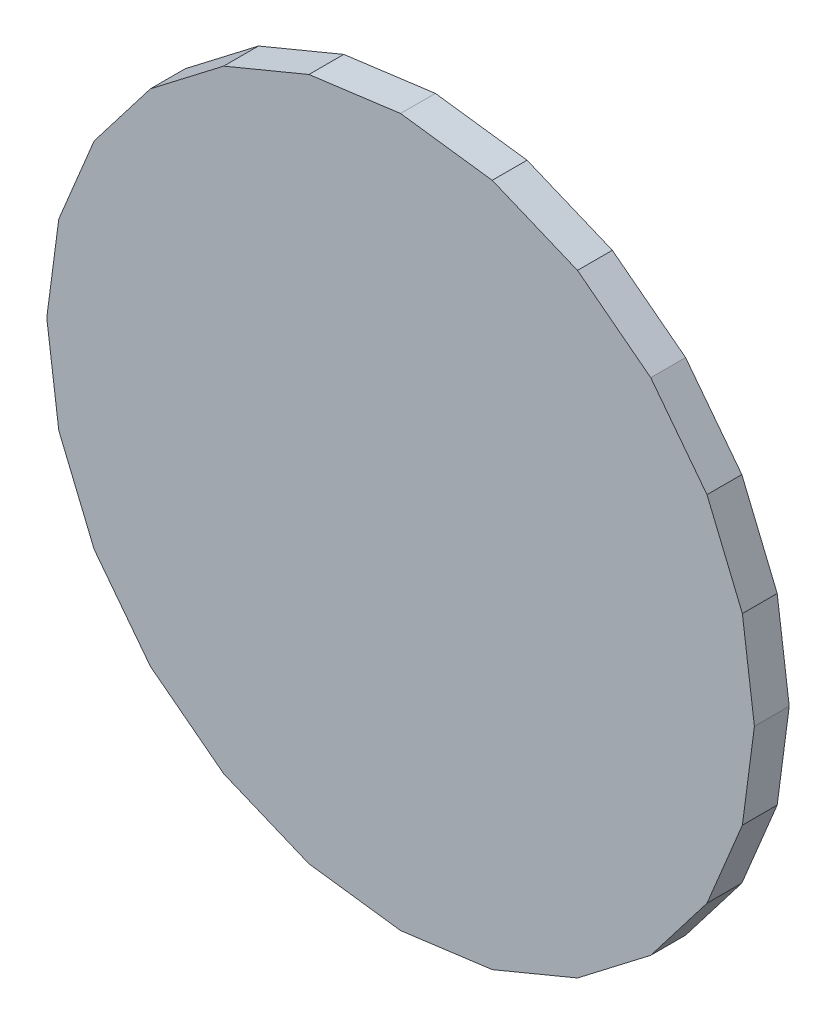
ISO-10303-21;
HEADER;
FILE_DESCRIPTION(('STEP AP214'),'2;1');
FILE_NAME('part.step','',(''),(''),'','','');
FILE_SCHEMA(('AUTOMOTIVE_DESIGN { 1 0 10303 214 1 1 1 1 }'));
ENDSEC;
DATA;
#1=APPLICATION_CONTEXT('core data for automotive mechanical design processes');
#2=APPLICATION_PROTOCOL_DEFINITION('international standard','automotive_design',2000,#1);
#3=PRODUCT_CONTEXT('',#1,'mechanical');
#4=PRODUCT('Part','Part','',(#3));
#5=PRODUCT_RELATED_PRODUCT_CATEGORY('part','',(#4));
#6=PRODUCT_DEFINITION_FORMATION('','',#4);
#7=PRODUCT_DEFINITION_CONTEXT('part definition',#1,'design');
#8=PRODUCT_DEFINITION('design','',#6,#7);
#9=PRODUCT_DEFINITION_SHAPE('','',#8);
#10=(LENGTH_UNIT() NAMED_UNIT(*) SI_UNIT(.MILLI.,.METRE.));
#11=(NAMED_UNIT(*) PLANE_ANGLE_UNIT() SI_UNIT($,.RADIAN.));
#12=(NAMED_UNIT(*) SI_UNIT($,.STERADIAN.) SOLID_ANGLE_UNIT());
#13=UNCERTAINTY_MEASURE_WITH_UNIT(LENGTH_MEASURE(1.E-05),#10,'distance_accuracy_value','');
#14=(GEOMETRIC_REPRESENTATION_CONTEXT(3) GLOBAL_UNCERTAINTY_ASSIGNED_CONTEXT((#13)) GLOBAL_UNIT_ASSIGNED_CONTEXT((#10,
#11,#12)) REPRESENTATION_CONTEXT('',''));
#15=CARTESIAN_POINT('',(0.,0.,0.));
#16=DIRECTION('',(0.,0.,1.));
#17=DIRECTION('',(1.,0.,0.));
#18=AXIS2_PLACEMENT_3D('',#15,#16,#17);
#19=CARTESIAN_POINT('',(0.,0.,0.05));
#20=DIRECTION('',(0.,0.,1.));
#21=DIRECTION('',(1.,0.,0.));
#22=AXIS2_PLACEMENT_3D('',#19,#20,#21);
#23=PLANE('',#22);
#24=DIRECTION('',(-0.923642864459661,0.383254300605684,0.));
#25=VECTOR('',#24,1.);
#26=CARTESIAN_POINT('',(0.254,0.439928,0.05));
#27=LINE('',#26,#25);
#28=CARTESIAN_POINT('',(0.131572,0.490728,0.05));
#29=VERTEX_POINT('',#28);
#30=CARTESIAN_POINT('',(0.254000000000001,0.439928000000001,0.05));
#31=VERTEX_POINT('',#30);
#32=EDGE_CURVE('E190',#29,#31,#27,.F.);
#33=ORIENTED_EDGE('',*,*,#32,.F.);
#34=DIRECTION('',(-0.991493340478673,0.130157426935396,0.));
#35=VECTOR('',#34,1.);
#36=CARTESIAN_POINT('',(0.131572,0.490728,0.05));
#37=LINE('',#36,#35);
#38=CARTESIAN_POINT('',(0.,0.507999999999999,0.05));
#39=VERTEX_POINT('',#38);
#40=EDGE_CURVE('E20',#39,#29,#37,.F.);
#41=ORIENTED_EDGE('',*,*,#40,.F.);
#42=DIRECTION('',(-0.991493340478673,-0.130157426935396,0.));
#43=VECTOR('',#42,1.);
#44=CARTESIAN_POINT('',(0.,0.508,0.05));
#45=LINE('',#44,#43);
#46=CARTESIAN_POINT('',(-0.131572,0.490728000000001,0.05));
#47=VERTEX_POINT('',#46);
#48=EDGE_CURVE('E179',#47,#39,#45,.F.);
#49=ORIENTED_EDGE('',*,*,#48,.F.);
#50=DIRECTION('',(-0.923642864459661,-0.383254300605684,0.));
#51=VECTOR('',#50,1.);
#52=CARTESIAN_POINT('',(-0.131572,0.490728,0.05));
#53=LINE('',#52,#51);
#54=CARTESIAN_POINT('',(-0.254,0.439927999999999,0.05));
#55=VERTEX_POINT('',#54);
#56=EDGE_CURVE('E174',#55,#47,#53,.F.);
#57=ORIENTED_EDGE('',*,*,#56,.F.);
#58=DIRECTION('',(-0.793051061905808,-0.609155163492906,0.));
#59=VECTOR('',#58,1.);
#60=CARTESIAN_POINT('',(-0.254,0.439928,0.05));
#61=LINE('',#60,#59);
#62=CARTESIAN_POINT('',(-0.359155999999999,0.359155999999999,0.05));
#63=VERTEX_POINT('',#62);
#64=EDGE_CURVE('E201',#63,#55,#61,.F.);
#65=ORIENTED_EDGE('',*,*,#64,.F.);
#66=DIRECTION('',(-0.609155163492906,-0.793051061905808,0.));
#67=VECTOR('',#66,1.);
#68=CARTESIAN_POINT('',(-0.359156,0.359156,0.05));
#69=LINE('',#68,#67);
#70=CARTESIAN_POINT('',(-0.439928000000001,0.254000000000001,0.05));
#71=VERTEX_POINT('',#70);
#72=EDGE_CURVE('E205',#71,#63,#69,.F.);
#73=ORIENTED_EDGE('',*,*,#72,.F.);
#74=DIRECTION('',(-0.383254300605684,-0.923642864459661,0.));
#75=VECTOR('',#74,1.);
#76=CARTESIAN_POINT('',(-0.439928,0.254,0.05));
#77=LINE('',#76,#75);
#78=CARTESIAN_POINT('',(-0.490728,0.131572,0.05));
#79=VERTEX_POINT('',#78);
#80=EDGE_CURVE('E209',#79,#71,#77,.F.);
#81=ORIENTED_EDGE('',*,*,#80,.F.);
#82=DIRECTION('',(-0.130157426935396,-0.991493340478673,0.));
#83=VECTOR('',#82,1.);
#84=CARTESIAN_POINT('',(-0.490728,0.131572,0.05));
#85=LINE('',#84,#83);
#86=CARTESIAN_POINT('',(-0.507999999999999,0.,0.05));
#87=VERTEX_POINT('',#86);
#88=EDGE_CURVE('E213',#87,#79,#85,.F.);
#89=ORIENTED_EDGE('',*,*,#88,.F.);
#90=DIRECTION('',(0.130157426935396,-0.991493340478673,0.));
#91=VECTOR('',#90,1.);
#92=CARTESIAN_POINT('',(-0.508,0.,0.05));
#93=LINE('',#92,#91);
#94=CARTESIAN_POINT('',(-0.490728000000001,-0.131572,0.05));
#95=VERTEX_POINT('',#94);
#96=EDGE_CURVE('E217',#95,#87,#93,.F.);
#97=ORIENTED_EDGE('',*,*,#96,.F.);
#98=DIRECTION('',(0.383254300605684,-0.923642864459661,0.));
#99=VECTOR('',#98,1.);
#100=CARTESIAN_POINT('',(-0.490728,-0.131572,0.05));
#101=LINE('',#100,#99);
#102=CARTESIAN_POINT('',(-0.439927999999999,-0.254,0.05));
#103=VERTEX_POINT('',#102);
#104=EDGE_CURVE('E221',#103,#95,#101,.F.);
#105=ORIENTED_EDGE('',*,*,#104,.F.);
#106=DIRECTION('',(0.609155163492906,-0.793051061905808,0.));
#107=VECTOR('',#106,1.);
#108=CARTESIAN_POINT('',(-0.439928,-0.254,0.05));
#109=LINE('',#108,#107);
#110=CARTESIAN_POINT('',(-0.359155999999999,-0.359155999999999,0.05));
#111=VERTEX_POINT('',#110);
#112=EDGE_CURVE('E225',#111,#103,#109,.F.);
#113=ORIENTED_EDGE('',*,*,#112,.F.);
#114=DIRECTION('',(0.793051061905808,-0.609155163492906,0.));
#115=VECTOR('',#114,1.);
#116=CARTESIAN_POINT('',(-0.359156,-0.359156,0.05));
#117=LINE('',#116,#115);
#118=CARTESIAN_POINT('',(-0.254000000000001,-0.439928000000001,0.05));
#119=VERTEX_POINT('',#118);
#120=EDGE_CURVE('E229',#119,#111,#117,.F.);
#121=ORIENTED_EDGE('',*,*,#120,.F.);
#122=DIRECTION('',(0.923642864459661,-0.383254300605684,0.));
#123=VECTOR('',#122,1.);
#124=CARTESIAN_POINT('',(-0.254,-0.439928,0.05));
#125=LINE('',#124,#123);
#126=CARTESIAN_POINT('',(-0.131572,-0.490728,0.05));
#127=VERTEX_POINT('',#126);
#128=EDGE_CURVE('E233',#127,#119,#125,.F.);
#129=ORIENTED_EDGE('',*,*,#128,.F.);
#130=DIRECTION('',(0.991493340478673,-0.130157426935396,0.));
#131=VECTOR('',#130,1.);
#132=CARTESIAN_POINT('',(-0.131572,-0.490728,0.05));
#133=LINE('',#132,#131);
#134=CARTESIAN_POINT('',(0.,-0.507999999999999,0.05));
#135=VERTEX_POINT('',#134);
#136=EDGE_CURVE('E237',#135,#127,#133,.F.);
#137=ORIENTED_EDGE('',*,*,#136,.F.);
#138=DIRECTION('',(0.991493340478673,0.130157426935396,0.));
#139=VECTOR('',#138,1.);
#140=CARTESIAN_POINT('',(0.,-0.508,0.05));
#141=LINE('',#140,#139);
#142=CARTESIAN_POINT('',(0.131572,-0.490728000000001,0.05));
#143=VERTEX_POINT('',#142);
#144=EDGE_CURVE('E241',#143,#135,#141,.F.);
#145=ORIENTED_EDGE('',*,*,#144,.F.);
#146=DIRECTION('',(0.923642864459661,0.383254300605684,0.));
#147=VECTOR('',#146,1.);
#148=CARTESIAN_POINT('',(0.131572,-0.490728,0.05));
#149=LINE('',#148,#147);
#150=CARTESIAN_POINT('',(0.254,-0.439927999999999,0.05));
#151=VERTEX_POINT('',#150);
#152=EDGE_CURVE('E245',#151,#143,#149,.F.);
#153=ORIENTED_EDGE('',*,*,#152,.F.);
#154=DIRECTION('',(0.793051061905808,0.609155163492906,0.));
#155=VECTOR('',#154,1.);
#156=CARTESIAN_POINT('',(0.254,-0.439928,0.05));
#157=LINE('',#156,#155);
#158=CARTESIAN_POINT('',(0.359155999999999,-0.359155999999999,0.05));
#159=VERTEX_POINT('',#158);
#160=EDGE_CURVE('E249',#159,#151,#157,.F.);
#161=ORIENTED_EDGE('',*,*,#160,.F.);
#162=DIRECTION('',(0.609155163492906,0.793051061905808,0.));
#163=VECTOR('',#162,1.);
#164=CARTESIAN_POINT('',(0.359156,-0.359156,0.05));
#165=LINE('',#164,#163);
#166=CARTESIAN_POINT('',(0.439928000000001,-0.254000000000001,0.05));
#167=VERTEX_POINT('',#166);
#168=EDGE_CURVE('E253',#167,#159,#165,.F.);
#169=ORIENTED_EDGE('',*,*,#168,.F.);
#170=DIRECTION('',(0.383254300605684,0.923642864459661,0.));
#171=VECTOR('',#170,1.);
#172=CARTESIAN_POINT('',(0.439928,-0.254,0.05));
#173=LINE('',#172,#171);
#174=CARTESIAN_POINT('',(0.490728,-0.131572,0.05));
#175=VERTEX_POINT('',#174);
#176=EDGE_CURVE('E257',#175,#167,#173,.F.);
#177=ORIENTED_EDGE('',*,*,#176,.F.);
#178=DIRECTION('',(0.130157426935396,0.991493340478673,0.));
#179=VECTOR('',#178,1.);
#180=CARTESIAN_POINT('',(0.490728,-0.131572,0.05));
#181=LINE('',#180,#179);
#182=CARTESIAN_POINT('',(0.507999999999999,0.,0.05));
#183=VERTEX_POINT('',#182);
#184=EDGE_CURVE('E261',#183,#175,#181,.F.);
#185=ORIENTED_EDGE('',*,*,#184,.F.);
#186=DIRECTION('',(-0.130157426935396,0.991493340478673,0.));
#187=VECTOR('',#186,1.);
#188=CARTESIAN_POINT('',(0.508,0.,0.05));
#189=LINE('',#188,#187);
#190=CARTESIAN_POINT('',(0.490728000000001,0.131572,0.05));
#191=VERTEX_POINT('',#190);
#192=EDGE_CURVE('E265',#191,#183,#189,.F.);
#193=ORIENTED_EDGE('',*,*,#192,.F.);
#194=DIRECTION('',(-0.383254300605684,0.923642864459661,0.));
#195=VECTOR('',#194,1.);
#196=CARTESIAN_POINT('',(0.490728,0.131572,0.05));
#197=LINE('',#196,#195);
#198=CARTESIAN_POINT('',(0.439927999999999,0.254,0.05));
#199=VERTEX_POINT('',#198);
#200=EDGE_CURVE('E269',#199,#191,#197,.F.);
#201=ORIENTED_EDGE('',*,*,#200,.F.);
#202=DIRECTION('',(-0.609155163492906,0.793051061905808,0.));
#203=VECTOR('',#202,1.);
#204=CARTESIAN_POINT('',(0.439928,0.254,0.05));
#205=LINE('',#204,#203);
#206=CARTESIAN_POINT('',(0.359155999999999,0.359155999999999,0.05));
#207=VERTEX_POINT('',#206);
#208=EDGE_CURVE('E273',#207,#199,#205,.F.);
#209=ORIENTED_EDGE('',*,*,#208,.F.);
#210=DIRECTION('',(-0.793051061905808,0.609155163492906,0.));
#211=VECTOR('',#210,1.);
#212=CARTESIAN_POINT('',(0.359156,0.359156,0.05));
#213=LINE('',#212,#211);
#214=EDGE_CURVE('E277',#31,#207,#213,.F.);
#215=ORIENTED_EDGE('',*,*,#214,.F.);
#216=EDGE_LOOP('',(#33,#41,#49,#57,#65,#73,#81,#89,#97,#105,#113,#121,#129,#137,#145,#153,#161,
#169,#177,#185,#193,#201,#209,#215));
#217=FACE_BOUND('',#216,.T.);
#218=ADVANCED_FACE('F17',(#217),#23,.T.);
#219=CARTESIAN_POINT('',(0.131572,0.490728,0.));
#220=DIRECTION('',(0.130157426935396,0.991493340478673,0.));
#221=DIRECTION('',(-0.991493340478673,0.130157426935396,0.));
#222=AXIS2_PLACEMENT_3D('',#219,#220,#221);
#223=PLANE('',#222);
#224=DIRECTION('',(0.,0.,1.));
#225=VECTOR('',#224,1.);
#226=CARTESIAN_POINT('',(0.131572000000001,0.490728000000002,0.));
#227=LINE('',#226,#225);
#228=CARTESIAN_POINT('',(0.131572,0.490728,0.));
#229=VERTEX_POINT('',#228);
#230=EDGE_CURVE('E281',#229,#29,#227,.T.);
#231=ORIENTED_EDGE('',*,*,#230,.F.);
#232=DIRECTION('',(-0.991493340478669,0.130157426935424,0.));
#233=VECTOR('',#232,1.);
#234=CARTESIAN_POINT('',(0.131572,0.490728,0.));
#235=LINE('',#234,#233);
#236=CARTESIAN_POINT('',(0.,0.507999999999998,0.));
#237=VERTEX_POINT('',#236);
#238=EDGE_CURVE('E196',#229,#237,#235,.T.);
#239=ORIENTED_EDGE('',*,*,#238,.T.);
#240=DIRECTION('',(0.,0.,1.));
#241=VECTOR('',#240,1.);
#242=CARTESIAN_POINT('',(0.,0.508,0.));
#243=LINE('',#242,#241);
#244=EDGE_CURVE('E184',#39,#237,#243,.F.);
#245=ORIENTED_EDGE('',*,*,#244,.F.);
#246=ORIENTED_EDGE('',*,*,#40,.T.);
#247=EDGE_LOOP('',(#231,#239,#245,#246));
#248=FACE_BOUND('',#247,.T.);
#249=ADVANCED_FACE('F195',(#248),#223,.T.);
#250=CARTESIAN_POINT('',(0.,0.508,0.));
#251=DIRECTION('',(-0.130157426935396,0.991493340478673,0.));
#252=DIRECTION('',(-0.991493340478673,-0.130157426935396,0.));
#253=AXIS2_PLACEMENT_3D('',#250,#251,#252);
#254=PLANE('',#253);
#255=ORIENTED_EDGE('',*,*,#244,.T.);
#256=DIRECTION('',(-0.991493340478669,-0.130157426935424,0.));
#257=VECTOR('',#256,1.);
#258=CARTESIAN_POINT('',(0.,0.508,0.));
#259=LINE('',#258,#257);
#260=CARTESIAN_POINT('',(-0.131572,0.490728000000002,0.));
#261=VERTEX_POINT('',#260);
#262=EDGE_CURVE('E286',#237,#261,#259,.T.);
#263=ORIENTED_EDGE('',*,*,#262,.T.);
#264=DIRECTION('',(0.,0.,1.));
#265=VECTOR('',#264,1.);
#266=CARTESIAN_POINT('',(-0.131572,0.490728,0.));
#267=LINE('',#266,#265);
#268=EDGE_CURVE('E186',#47,#261,#267,.F.);
#269=ORIENTED_EDGE('',*,*,#268,.F.);
#270=ORIENTED_EDGE('',*,*,#48,.T.);
#271=EDGE_LOOP('',(#255,#263,#269,#270));
#272=FACE_BOUND('',#271,.T.);
#273=ADVANCED_FACE('F181',(#272),#254,.T.);
#274=CARTESIAN_POINT('',(-0.131572,0.490728,0.));
#275=DIRECTION('',(-0.383254300605684,0.923642864459661,0.));
#276=DIRECTION('',(-0.923642864459661,-0.383254300605684,0.));
#277=AXIS2_PLACEMENT_3D('',#274,#275,#276);
#278=PLANE('',#277);
#279=ORIENTED_EDGE('',*,*,#268,.T.);
#280=DIRECTION('',(-0.923642864459667,-0.38325430060567,0.));
#281=VECTOR('',#280,1.);
#282=CARTESIAN_POINT('',(-0.131572,0.490728,0.));
#283=LINE('',#282,#281);
#284=CARTESIAN_POINT('',(-0.254,0.439927999999999,0.));
#285=VERTEX_POINT('',#284);
#286=EDGE_CURVE('E288',#261,#285,#283,.T.);
#287=ORIENTED_EDGE('',*,*,#286,.T.);
#288=DIRECTION('',(0.,0.,1.));
#289=VECTOR('',#288,1.);
#290=CARTESIAN_POINT('',(-0.254,0.439928,0.));
#291=LINE('',#290,#289);
#292=EDGE_CURVE('E203',#55,#285,#291,.F.);
#293=ORIENTED_EDGE('',*,*,#292,.F.);
#294=ORIENTED_EDGE('',*,*,#56,.T.);
#295=EDGE_LOOP('',(#279,#287,#293,#294));
#296=FACE_BOUND('',#295,.T.);
#297=ADVANCED_FACE('F450',(#296),#278,.T.);
#298=CARTESIAN_POINT('',(-0.254,0.439928,0.));
#299=DIRECTION('',(-0.609155163492906,0.793051061905808,0.));
#300=DIRECTION('',(-0.793051061905808,-0.609155163492906,0.));
#301=AXIS2_PLACEMENT_3D('',#298,#299,#300);
#302=PLANE('',#301);
#303=ORIENTED_EDGE('',*,*,#292,.T.);
#304=DIRECTION('',(-0.793051061905827,-0.609155163492882,0.));
#305=VECTOR('',#304,1.);
#306=CARTESIAN_POINT('',(-0.254,0.439928,0.));
#307=LINE('',#306,#305);
#308=CARTESIAN_POINT('',(-0.359155999999999,0.359155999999998,0.));
#309=VERTEX_POINT('',#308);
#310=EDGE_CURVE('E291',#285,#309,#307,.T.);
#311=ORIENTED_EDGE('',*,*,#310,.T.);
#312=DIRECTION('',(0.,0.,1.));
#313=VECTOR('',#312,1.);
#314=CARTESIAN_POINT('',(-0.359156,0.359156,0.));
#315=LINE('',#314,#313);
#316=EDGE_CURVE('E207',#63,#309,#315,.F.);
#317=ORIENTED_EDGE('',*,*,#316,.F.);
#318=ORIENTED_EDGE('',*,*,#64,.T.);
#319=EDGE_LOOP('',(#303,#311,#317,#318));
#320=FACE_BOUND('',#319,.T.);
#321=ADVANCED_FACE('F449',(#320),#302,.T.);
#322=CARTESIAN_POINT('',(-0.359156,0.359156,0.));
#323=DIRECTION('',(-0.793051061905808,0.609155163492906,0.));
#324=DIRECTION('',(-0.609155163492906,-0.793051061905808,0.));
#325=AXIS2_PLACEMENT_3D('',#322,#323,#324);
#326=PLANE('',#325);
#327=ORIENTED_EDGE('',*,*,#316,.T.);
#328=DIRECTION('',(-0.609155163492882,-0.793051061905827,0.));
#329=VECTOR('',#328,1.);
#330=CARTESIAN_POINT('',(-0.359156,0.359156,0.));
#331=LINE('',#330,#329);
#332=CARTESIAN_POINT('',(-0.439928000000002,0.254000000000001,0.));
#333=VERTEX_POINT('',#332);
#334=EDGE_CURVE('E294',#309,#333,#331,.T.);
#335=ORIENTED_EDGE('',*,*,#334,.T.);
#336=DIRECTION('',(0.,0.,1.));
#337=VECTOR('',#336,1.);
#338=CARTESIAN_POINT('',(-0.439928,0.254,0.));
#339=LINE('',#338,#337);
#340=EDGE_CURVE('E211',#71,#333,#339,.F.);
#341=ORIENTED_EDGE('',*,*,#340,.F.);
#342=ORIENTED_EDGE('',*,*,#72,.T.);
#343=EDGE_LOOP('',(#327,#335,#341,#342));
#344=FACE_BOUND('',#343,.T.);
#345=ADVANCED_FACE('F443',(#344),#326,.T.);
#346=CARTESIAN_POINT('',(-0.439928,0.254,0.));
#347=DIRECTION('',(-0.923642864459661,0.383254300605684,0.));
#348=DIRECTION('',(-0.383254300605684,-0.923642864459661,0.));
#349=AXIS2_PLACEMENT_3D('',#346,#347,#348);
#350=PLANE('',#349);
#351=ORIENTED_EDGE('',*,*,#340,.T.);
#352=DIRECTION('',(-0.38325430060567,-0.923642864459667,0.));
#353=VECTOR('',#352,1.);
#354=CARTESIAN_POINT('',(-0.439928,0.254,0.));
#355=LINE('',#354,#353);
#356=CARTESIAN_POINT('',(-0.490728000000001,0.131572,0.));
#357=VERTEX_POINT('',#356);
#358=EDGE_CURVE('E297',#333,#357,#355,.T.);
#359=ORIENTED_EDGE('',*,*,#358,.T.);
#360=DIRECTION('',(0.,0.,1.));
#361=VECTOR('',#360,1.);
#362=CARTESIAN_POINT('',(-0.490728,0.131572,0.));
#363=LINE('',#362,#361);
#364=EDGE_CURVE('E215',#79,#357,#363,.F.);
#365=ORIENTED_EDGE('',*,*,#364,.F.);
#366=ORIENTED_EDGE('',*,*,#80,.T.);
#367=EDGE_LOOP('',(#351,#359,#365,#366));
#368=FACE_BOUND('',#367,.T.);
#369=ADVANCED_FACE('F439',(#368),#350,.T.);
#370=CARTESIAN_POINT('',(-0.490728,0.131572,0.));
#371=DIRECTION('',(-0.991493340478673,0.130157426935396,0.));
#372=DIRECTION('',(-0.130157426935396,-0.991493340478673,0.));
#373=AXIS2_PLACEMENT_3D('',#370,#371,#372);
#374=PLANE('',#373);
#375=ORIENTED_EDGE('',*,*,#364,.T.);
#376=DIRECTION('',(-0.130157426935424,-0.991493340478669,0.));
#377=VECTOR('',#376,1.);
#378=CARTESIAN_POINT('',(-0.490728,0.131572,0.));
#379=LINE('',#378,#377);
#380=CARTESIAN_POINT('',(-0.507999999999998,0.,0.));
#381=VERTEX_POINT('',#380);
#382=EDGE_CURVE('E300',#357,#381,#379,.T.);
#383=ORIENTED_EDGE('',*,*,#382,.T.);
#384=DIRECTION('',(0.,0.,1.));
#385=VECTOR('',#384,1.);
#386=CARTESIAN_POINT('',(-0.508,0.,0.));
#387=LINE('',#386,#385);
#388=EDGE_CURVE('E219',#87,#381,#387,.F.);
#389=ORIENTED_EDGE('',*,*,#388,.F.);
#390=ORIENTED_EDGE('',*,*,#88,.T.);
#391=EDGE_LOOP('',(#375,#383,#389,#390));
#392=FACE_BOUND('',#391,.T.);
#393=ADVANCED_FACE('F433',(#392),#374,.T.);
#394=CARTESIAN_POINT('',(-0.508,0.,0.));
#395=DIRECTION('',(-0.991493340478673,-0.130157426935396,0.));
#396=DIRECTION('',(0.130157426935396,-0.991493340478673,0.));
#397=AXIS2_PLACEMENT_3D('',#394,#395,#396);
#398=PLANE('',#397);
#399=ORIENTED_EDGE('',*,*,#388,.T.);
#400=DIRECTION('',(0.130157426935424,-0.991493340478669,0.));
#401=VECTOR('',#400,1.);
#402=CARTESIAN_POINT('',(-0.508,0.,0.));
#403=LINE('',#402,#401);
#404=CARTESIAN_POINT('',(-0.490728000000002,-0.131572,0.));
#405=VERTEX_POINT('',#404);
#406=EDGE_CURVE('E303',#381,#405,#403,.T.);
#407=ORIENTED_EDGE('',*,*,#406,.T.);
#408=DIRECTION('',(0.,0.,1.));
#409=VECTOR('',#408,1.);
#410=CARTESIAN_POINT('',(-0.490728,-0.131572,0.));
#411=LINE('',#410,#409);
#412=EDGE_CURVE('E223',#95,#405,#411,.F.);
#413=ORIENTED_EDGE('',*,*,#412,.F.);
#414=ORIENTED_EDGE('',*,*,#96,.T.);
#415=EDGE_LOOP('',(#399,#407,#413,#414));
#416=FACE_BOUND('',#415,.T.);
#417=ADVANCED_FACE('F429',(#416),#398,.T.);
#418=CARTESIAN_POINT('',(-0.490728,-0.131572,0.));
#419=DIRECTION('',(-0.923642864459661,-0.383254300605684,0.));
#420=DIRECTION('',(0.383254300605684,-0.923642864459661,0.));
#421=AXIS2_PLACEMENT_3D('',#418,#419,#420);
#422=PLANE('',#421);
#423=ORIENTED_EDGE('',*,*,#412,.T.);
#424=DIRECTION('',(0.38325430060567,-0.923642864459667,0.));
#425=VECTOR('',#424,1.);
#426=CARTESIAN_POINT('',(-0.490728,-0.131572,0.));
#427=LINE('',#426,#425);
#428=CARTESIAN_POINT('',(-0.439927999999999,-0.254,0.));
#429=VERTEX_POINT('',#428);
#430=EDGE_CURVE('E306',#405,#429,#427,.T.);
#431=ORIENTED_EDGE('',*,*,#430,.T.);
#432=DIRECTION('',(0.,0.,1.));
#433=VECTOR('',#432,1.);
#434=CARTESIAN_POINT('',(-0.439928,-0.254,0.));
#435=LINE('',#434,#433);
#436=EDGE_CURVE('E227',#103,#429,#435,.F.);
#437=ORIENTED_EDGE('',*,*,#436,.F.);
#438=ORIENTED_EDGE('',*,*,#104,.T.);
#439=EDGE_LOOP('',(#423,#431,#437,#438));
#440=FACE_BOUND('',#439,.T.);
#441=ADVANCED_FACE('F423',(#440),#422,.T.);
#442=CARTESIAN_POINT('',(-0.439928,-0.254,0.));
#443=DIRECTION('',(-0.793051061905808,-0.609155163492906,0.));
#444=DIRECTION('',(0.609155163492906,-0.793051061905808,0.));
#445=AXIS2_PLACEMENT_3D('',#442,#443,#444);
#446=PLANE('',#445);
#447=ORIENTED_EDGE('',*,*,#436,.T.);
#448=DIRECTION('',(0.609155163492882,-0.793051061905827,0.));
#449=VECTOR('',#448,1.);
#450=CARTESIAN_POINT('',(-0.439928,-0.254,0.));
#451=LINE('',#450,#449);
#452=CARTESIAN_POINT('',(-0.359155999999998,-0.359155999999999,0.));
#453=VERTEX_POINT('',#452);
#454=EDGE_CURVE('E309',#429,#453,#451,.T.);
#455=ORIENTED_EDGE('',*,*,#454,.T.);
#456=DIRECTION('',(0.,0.,1.));
#457=VECTOR('',#456,1.);
#458=CARTESIAN_POINT('',(-0.359156,-0.359156,0.));
#459=LINE('',#458,#457);
#460=EDGE_CURVE('E231',#111,#453,#459,.F.);
#461=ORIENTED_EDGE('',*,*,#460,.F.);
#462=ORIENTED_EDGE('',*,*,#112,.T.);
#463=EDGE_LOOP('',(#447,#455,#461,#462));
#464=FACE_BOUND('',#463,.T.);
#465=ADVANCED_FACE('F419',(#464),#446,.T.);
#466=CARTESIAN_POINT('',(-0.359156,-0.359156,0.));
#467=DIRECTION('',(-0.609155163492906,-0.793051061905808,0.));
#468=DIRECTION('',(0.793051061905808,-0.609155163492906,0.));
#469=AXIS2_PLACEMENT_3D('',#466,#467,#468);
#470=PLANE('',#469);
#471=ORIENTED_EDGE('',*,*,#460,.T.);
#472=DIRECTION('',(0.793051061905827,-0.609155163492882,0.));
#473=VECTOR('',#472,1.);
#474=CARTESIAN_POINT('',(-0.359156,-0.359156,0.));
#475=LINE('',#474,#473);
#476=CARTESIAN_POINT('',(-0.254000000000001,-0.439928000000002,0.));
#477=VERTEX_POINT('',#476);
#478=EDGE_CURVE('E312',#453,#477,#475,.T.);
#479=ORIENTED_EDGE('',*,*,#478,.T.);
#480=DIRECTION('',(0.,0.,1.));
#481=VECTOR('',#480,1.);
#482=CARTESIAN_POINT('',(-0.254,-0.439928,0.));
#483=LINE('',#482,#481);
#484=EDGE_CURVE('E235',#119,#477,#483,.F.);
#485=ORIENTED_EDGE('',*,*,#484,.F.);
#486=ORIENTED_EDGE('',*,*,#120,.T.);
#487=EDGE_LOOP('',(#471,#479,#485,#486));
#488=FACE_BOUND('',#487,.T.);
#489=ADVANCED_FACE('F413',(#488),#470,.T.);
#490=CARTESIAN_POINT('',(-0.254,-0.439928,0.));
#491=DIRECTION('',(-0.383254300605684,-0.923642864459661,0.));
#492=DIRECTION('',(0.923642864459661,-0.383254300605684,0.));
#493=AXIS2_PLACEMENT_3D('',#490,#491,#492);
#494=PLANE('',#493);
#495=ORIENTED_EDGE('',*,*,#484,.T.);
#496=DIRECTION('',(0.923642864459667,-0.38325430060567,0.));
#497=VECTOR('',#496,1.);
#498=CARTESIAN_POINT('',(-0.254,-0.439928,0.));
#499=LINE('',#498,#497);
#500=CARTESIAN_POINT('',(-0.131572,-0.490728000000001,0.));
#501=VERTEX_POINT('',#500);
#502=EDGE_CURVE('E315',#477,#501,#499,.T.);
#503=ORIENTED_EDGE('',*,*,#502,.T.);
#504=DIRECTION('',(0.,0.,1.));
#505=VECTOR('',#504,1.);
#506=CARTESIAN_POINT('',(-0.131572,-0.490728,0.));
#507=LINE('',#506,#505);
#508=EDGE_CURVE('E239',#127,#501,#507,.F.);
#509=ORIENTED_EDGE('',*,*,#508,.F.);
#510=ORIENTED_EDGE('',*,*,#128,.T.);
#511=EDGE_LOOP('',(#495,#503,#509,#510));
#512=FACE_BOUND('',#511,.T.);
#513=ADVANCED_FACE('F409',(#512),#494,.T.);
#514=CARTESIAN_POINT('',(-0.131572,-0.490728,0.));
#515=DIRECTION('',(-0.130157426935396,-0.991493340478673,0.));
#516=DIRECTION('',(0.991493340478673,-0.130157426935396,0.));
#517=AXIS2_PLACEMENT_3D('',#514,#515,#516);
#518=PLANE('',#517);
#519=ORIENTED_EDGE('',*,*,#508,.T.);
#520=DIRECTION('',(0.991493340478669,-0.130157426935424,0.));
#521=VECTOR('',#520,1.);
#522=CARTESIAN_POINT('',(-0.131572,-0.490728,0.));
#523=LINE('',#522,#521);
#524=CARTESIAN_POINT('',(0.,-0.507999999999998,0.));
#525=VERTEX_POINT('',#524);
#526=EDGE_CURVE('E318',#501,#525,#523,.T.);
#527=ORIENTED_EDGE('',*,*,#526,.T.);
#528=DIRECTION('',(0.,0.,1.));
#529=VECTOR('',#528,1.);
#530=CARTESIAN_POINT('',(0.,-0.508,0.));
#531=LINE('',#530,#529);
#532=EDGE_CURVE('E243',#135,#525,#531,.F.);
#533=ORIENTED_EDGE('',*,*,#532,.F.);
#534=ORIENTED_EDGE('',*,*,#136,.T.);
#535=EDGE_LOOP('',(#519,#527,#533,#534));
#536=FACE_BOUND('',#535,.T.);
#537=ADVANCED_FACE('F403',(#536),#518,.T.);
#538=CARTESIAN_POINT('',(0.,-0.508,0.));
#539=DIRECTION('',(0.130157426935396,-0.991493340478673,0.));
#540=DIRECTION('',(0.991493340478673,0.130157426935396,0.));
#541=AXIS2_PLACEMENT_3D('',#538,#539,#540);
#542=PLANE('',#541);
#543=ORIENTED_EDGE('',*,*,#532,.T.);
#544=DIRECTION('',(0.991493340478669,0.130157426935424,0.));
#545=VECTOR('',#544,1.);
#546=CARTESIAN_POINT('',(0.,-0.508,0.));
#547=LINE('',#546,#545);
#548=CARTESIAN_POINT('',(0.131572,-0.490728000000002,0.));
#549=VERTEX_POINT('',#548);
#550=EDGE_CURVE('E321',#525,#549,#547,.T.);
#551=ORIENTED_EDGE('',*,*,#550,.T.);
#552=DIRECTION('',(0.,0.,1.));
#553=VECTOR('',#552,1.);
#554=CARTESIAN_POINT('',(0.131572,-0.490728,0.));
#555=LINE('',#554,#553);
#556=EDGE_CURVE('E247',#143,#549,#555,.F.);
#557=ORIENTED_EDGE('',*,*,#556,.F.);
#558=ORIENTED_EDGE('',*,*,#144,.T.);
#559=EDGE_LOOP('',(#543,#551,#557,#558));
#560=FACE_BOUND('',#559,.T.);
#561=ADVANCED_FACE('F399',(#560),#542,.T.);
#562=CARTESIAN_POINT('',(0.131572,-0.490728,0.));
#563=DIRECTION('',(0.383254300605684,-0.923642864459661,0.));
#564=DIRECTION('',(0.923642864459661,0.383254300605684,0.));
#565=AXIS2_PLACEMENT_3D('',#562,#563,#564);
#566=PLANE('',#565);
#567=ORIENTED_EDGE('',*,*,#556,.T.);
#568=DIRECTION('',(0.923642864459667,0.38325430060567,0.));
#569=VECTOR('',#568,1.);
#570=CARTESIAN_POINT('',(0.131572,-0.490728,0.));
#571=LINE('',#570,#569);
#572=CARTESIAN_POINT('',(0.254,-0.439927999999999,0.));
#573=VERTEX_POINT('',#572);
#574=EDGE_CURVE('E324',#549,#573,#571,.T.);
#575=ORIENTED_EDGE('',*,*,#574,.T.);
#576=DIRECTION('',(0.,0.,1.));
#577=VECTOR('',#576,1.);
#578=CARTESIAN_POINT('',(0.254,-0.439928,0.));
#579=LINE('',#578,#577);
#580=EDGE_CURVE('E251',#151,#573,#579,.F.);
#581=ORIENTED_EDGE('',*,*,#580,.F.);
#582=ORIENTED_EDGE('',*,*,#152,.T.);
#583=EDGE_LOOP('',(#567,#575,#581,#582));
#584=FACE_BOUND('',#583,.T.);
#585=ADVANCED_FACE('F393',(#584),#566,.T.);
#586=CARTESIAN_POINT('',(0.254,-0.439928,0.));
#587=DIRECTION('',(0.609155163492906,-0.793051061905808,0.));
#588=DIRECTION('',(0.793051061905808,0.609155163492906,0.));
#589=AXIS2_PLACEMENT_3D('',#586,#587,#588);
#590=PLANE('',#589);
#591=ORIENTED_EDGE('',*,*,#580,.T.);
#592=DIRECTION('',(0.793051061905827,0.609155163492882,0.));
#593=VECTOR('',#592,1.);
#594=CARTESIAN_POINT('',(0.254,-0.439928,0.));
#595=LINE('',#594,#593);
#596=CARTESIAN_POINT('',(0.359155999999999,-0.359155999999998,0.));
#597=VERTEX_POINT('',#596);
#598=EDGE_CURVE('E327',#573,#597,#595,.T.);
#599=ORIENTED_EDGE('',*,*,#598,.T.);
#600=DIRECTION('',(0.,0.,1.));
#601=VECTOR('',#600,1.);
#602=CARTESIAN_POINT('',(0.359156,-0.359156,0.));
#603=LINE('',#602,#601);
#604=EDGE_CURVE('E255',#159,#597,#603,.F.);
#605=ORIENTED_EDGE('',*,*,#604,.F.);
#606=ORIENTED_EDGE('',*,*,#160,.T.);
#607=EDGE_LOOP('',(#591,#599,#605,#606));
#608=FACE_BOUND('',#607,.T.);
#609=ADVANCED_FACE('F389',(#608),#590,.T.);
#610=CARTESIAN_POINT('',(0.359156,-0.359156,0.));
#611=DIRECTION('',(0.793051061905808,-0.609155163492906,0.));
#612=DIRECTION('',(0.609155163492906,0.793051061905808,0.));
#613=AXIS2_PLACEMENT_3D('',#610,#611,#612);
#614=PLANE('',#613);
#615=ORIENTED_EDGE('',*,*,#604,.T.);
#616=DIRECTION('',(0.609155163492882,0.793051061905827,0.));
#617=VECTOR('',#616,1.);
#618=CARTESIAN_POINT('',(0.359156,-0.359156,0.));
#619=LINE('',#618,#617);
#620=CARTESIAN_POINT('',(0.439928000000002,-0.254000000000001,0.));
#621=VERTEX_POINT('',#620);
#622=EDGE_CURVE('E330',#597,#621,#619,.T.);
#623=ORIENTED_EDGE('',*,*,#622,.T.);
#624=DIRECTION('',(0.,0.,1.));
#625=VECTOR('',#624,1.);
#626=CARTESIAN_POINT('',(0.439928,-0.254,0.));
#627=LINE('',#626,#625);
#628=EDGE_CURVE('E259',#167,#621,#627,.F.);
#629=ORIENTED_EDGE('',*,*,#628,.F.);
#630=ORIENTED_EDGE('',*,*,#168,.T.);
#631=EDGE_LOOP('',(#615,#623,#629,#630));
#632=FACE_BOUND('',#631,.T.);
#633=ADVANCED_FACE('F383',(#632),#614,.T.);
#634=CARTESIAN_POINT('',(0.439928,-0.254,0.));
#635=DIRECTION('',(0.923642864459661,-0.383254300605684,0.));
#636=DIRECTION('',(0.383254300605684,0.923642864459661,0.));
#637=AXIS2_PLACEMENT_3D('',#634,#635,#636);
#638=PLANE('',#637);
#639=ORIENTED_EDGE('',*,*,#628,.T.);
#640=DIRECTION('',(0.38325430060567,0.923642864459667,0.));
#641=VECTOR('',#640,1.);
#642=CARTESIAN_POINT('',(0.439928,-0.254,0.));
#643=LINE('',#642,#641);
#644=CARTESIAN_POINT('',(0.490728000000001,-0.131572,0.));
#645=VERTEX_POINT('',#644);
#646=EDGE_CURVE('E333',#621,#645,#643,.T.);
#647=ORIENTED_EDGE('',*,*,#646,.T.);
#648=DIRECTION('',(0.,0.,1.));
#649=VECTOR('',#648,1.);
#650=CARTESIAN_POINT('',(0.490728,-0.131572,0.));
#651=LINE('',#650,#649);
#652=EDGE_CURVE('E263',#175,#645,#651,.F.);
#653=ORIENTED_EDGE('',*,*,#652,.F.);
#654=ORIENTED_EDGE('',*,*,#176,.T.);
#655=EDGE_LOOP('',(#639,#647,#653,#654));
#656=FACE_BOUND('',#655,.T.);
#657=ADVANCED_FACE('F379',(#656),#638,.T.);
#658=CARTESIAN_POINT('',(0.490728,-0.131572,0.));
#659=DIRECTION('',(0.991493340478673,-0.130157426935396,0.));
#660=DIRECTION('',(0.130157426935396,0.991493340478673,0.));
#661=AXIS2_PLACEMENT_3D('',#658,#659,#660);
#662=PLANE('',#661);
#663=ORIENTED_EDGE('',*,*,#652,.T.);
#664=DIRECTION('',(0.130157426935424,0.991493340478669,0.));
#665=VECTOR('',#664,1.);
#666=CARTESIAN_POINT('',(0.490728,-0.131572,0.));
#667=LINE('',#666,#665);
#668=CARTESIAN_POINT('',(0.507999999999998,0.,0.));
#669=VERTEX_POINT('',#668);
#670=EDGE_CURVE('E336',#645,#669,#667,.T.);
#671=ORIENTED_EDGE('',*,*,#670,.T.);
#672=DIRECTION('',(0.,0.,1.));
#673=VECTOR('',#672,1.);
#674=CARTESIAN_POINT('',(0.508,0.,0.));
#675=LINE('',#674,#673);
#676=EDGE_CURVE('E267',#183,#669,#675,.F.);
#677=ORIENTED_EDGE('',*,*,#676,.F.);
#678=ORIENTED_EDGE('',*,*,#184,.T.);
#679=EDGE_LOOP('',(#663,#671,#677,#678));
#680=FACE_BOUND('',#679,.T.);
#681=ADVANCED_FACE('F373',(#680),#662,.T.);
#682=CARTESIAN_POINT('',(0.508,0.,0.));
#683=DIRECTION('',(0.991493340478673,0.130157426935396,0.));
#684=DIRECTION('',(-0.130157426935396,0.991493340478673,0.));
#685=AXIS2_PLACEMENT_3D('',#682,#683,#684);
#686=PLANE('',#685);
#687=ORIENTED_EDGE('',*,*,#676,.T.);
#688=DIRECTION('',(-0.130157426935424,0.991493340478669,0.));
#689=VECTOR('',#688,1.);
#690=CARTESIAN_POINT('',(0.508,0.,0.));
#691=LINE('',#690,#689);
#692=CARTESIAN_POINT('',(0.490728000000002,0.131572,0.));
#693=VERTEX_POINT('',#692);
#694=EDGE_CURVE('E339',#669,#693,#691,.T.);
#695=ORIENTED_EDGE('',*,*,#694,.T.);
#696=DIRECTION('',(0.,0.,1.));
#697=VECTOR('',#696,1.);
#698=CARTESIAN_POINT('',(0.490728,0.131572,0.));
#699=LINE('',#698,#697);
#700=EDGE_CURVE('E271',#191,#693,#699,.F.);
#701=ORIENTED_EDGE('',*,*,#700,.F.);
#702=ORIENTED_EDGE('',*,*,#192,.T.);
#703=EDGE_LOOP('',(#687,#695,#701,#702));
#704=FACE_BOUND('',#703,.T.);
#705=ADVANCED_FACE('F369',(#704),#686,.T.);
#706=CARTESIAN_POINT('',(0.490728,0.131572,0.));
#707=DIRECTION('',(0.923642864459661,0.383254300605684,0.));
#708=DIRECTION('',(-0.383254300605684,0.923642864459661,0.));
#709=AXIS2_PLACEMENT_3D('',#706,#707,#708);
#710=PLANE('',#709);
#711=ORIENTED_EDGE('',*,*,#700,.T.);
#712=DIRECTION('',(-0.38325430060567,0.923642864459667,0.));
#713=VECTOR('',#712,1.);
#714=CARTESIAN_POINT('',(0.490728,0.131572,0.));
#715=LINE('',#714,#713);
#716=CARTESIAN_POINT('',(0.439927999999999,0.254,0.));
#717=VERTEX_POINT('',#716);
#718=EDGE_CURVE('E342',#693,#717,#715,.T.);
#719=ORIENTED_EDGE('',*,*,#718,.T.);
#720=DIRECTION('',(0.,0.,1.));
#721=VECTOR('',#720,1.);
#722=CARTESIAN_POINT('',(0.439928,0.254,0.));
#723=LINE('',#722,#721);
#724=EDGE_CURVE('E275',#199,#717,#723,.F.);
#725=ORIENTED_EDGE('',*,*,#724,.F.);
#726=ORIENTED_EDGE('',*,*,#200,.T.);
#727=EDGE_LOOP('',(#711,#719,#725,#726));
#728=FACE_BOUND('',#727,.T.);
#729=ADVANCED_FACE('F363',(#728),#710,.T.);
#730=CARTESIAN_POINT('',(0.439928,0.254,0.));
#731=DIRECTION('',(0.793051061905808,0.609155163492906,0.));
#732=DIRECTION('',(-0.609155163492906,0.793051061905808,0.));
#733=AXIS2_PLACEMENT_3D('',#730,#731,#732);
#734=PLANE('',#733);
#735=ORIENTED_EDGE('',*,*,#724,.T.);
#736=DIRECTION('',(-0.609155163492882,0.793051061905827,0.));
#737=VECTOR('',#736,1.);
#738=CARTESIAN_POINT('',(0.439928,0.254,0.));
#739=LINE('',#738,#737);
#740=CARTESIAN_POINT('',(0.359155999999998,0.359155999999999,0.));
#741=VERTEX_POINT('',#740);
#742=EDGE_CURVE('E345',#717,#741,#739,.T.);
#743=ORIENTED_EDGE('',*,*,#742,.T.);
#744=DIRECTION('',(0.,0.,1.));
#745=VECTOR('',#744,1.);
#746=CARTESIAN_POINT('',(0.359156,0.359156,0.));
#747=LINE('',#746,#745);
#748=EDGE_CURVE('E279',#207,#741,#747,.F.);
#749=ORIENTED_EDGE('',*,*,#748,.F.);
#750=ORIENTED_EDGE('',*,*,#208,.T.);
#751=EDGE_LOOP('',(#735,#743,#749,#750));
#752=FACE_BOUND('',#751,.T.);
#753=ADVANCED_FACE('F358',(#752),#734,.T.);
#754=CARTESIAN_POINT('',(0.359156,0.359156,0.));
#755=DIRECTION('',(0.609155163492906,0.793051061905808,0.));
#756=DIRECTION('',(-0.793051061905808,0.609155163492906,0.));
#757=AXIS2_PLACEMENT_3D('',#754,#755,#756);
#758=PLANE('',#757);
#759=ORIENTED_EDGE('',*,*,#748,.T.);
#760=DIRECTION('',(-0.793051061905827,0.609155163492882,0.));
#761=VECTOR('',#760,1.);
#762=CARTESIAN_POINT('',(0.359156,0.359156,0.));
#763=LINE('',#762,#761);
#764=CARTESIAN_POINT('',(0.254000000000001,0.439928000000002,0.));
#765=VERTEX_POINT('',#764);
#766=EDGE_CURVE('E26',#741,#765,#763,.T.);
#767=ORIENTED_EDGE('',*,*,#766,.T.);
#768=DIRECTION('',(0.,0.,1.));
#769=VECTOR('',#768,1.);
#770=CARTESIAN_POINT('',(0.254,0.439928,0.));
#771=LINE('',#770,#769);
#772=EDGE_CURVE('E34',#31,#765,#771,.F.);
#773=ORIENTED_EDGE('',*,*,#772,.F.);
#774=ORIENTED_EDGE('',*,*,#214,.T.);
#775=EDGE_LOOP('',(#759,#767,#773,#774));
#776=FACE_BOUND('',#775,.T.);
#777=ADVANCED_FACE('F351',(#776),#758,.T.);
#778=CARTESIAN_POINT('',(0.254,0.439928,0.));
#779=DIRECTION('',(0.383254300605684,0.923642864459661,0.));
#780=DIRECTION('',(-0.923642864459661,0.383254300605684,0.));
#781=AXIS2_PLACEMENT_3D('',#778,#779,#780);
#782=PLANE('',#781);
#783=ORIENTED_EDGE('',*,*,#772,.T.);
#784=DIRECTION('',(-0.923642864459667,0.38325430060567,0.));
#785=VECTOR('',#784,1.);
#786=CARTESIAN_POINT('',(0.254,0.439928,0.));
#787=LINE('',#786,#785);
#788=EDGE_CURVE('E11',#765,#229,#787,.T.);
#789=ORIENTED_EDGE('',*,*,#788,.T.);
#790=ORIENTED_EDGE('',*,*,#230,.T.);
#791=ORIENTED_EDGE('',*,*,#32,.T.);
#792=EDGE_LOOP('',(#783,#789,#790,#791));
#793=FACE_BOUND('',#792,.T.);
#794=ADVANCED_FACE('F451',(#793),#782,.T.);
#795=CARTESIAN_POINT('',(0.,0.,0.));
#796=DIRECTION('',(0.,0.,1.));
#797=DIRECTION('',(1.,0.,0.));
#798=AXIS2_PLACEMENT_3D('',#795,#796,#797);
#799=PLANE('',#798);
#800=ORIENTED_EDGE('',*,*,#766,.F.);
#801=ORIENTED_EDGE('',*,*,#742,.F.);
#802=ORIENTED_EDGE('',*,*,#718,.F.);
#803=ORIENTED_EDGE('',*,*,#694,.F.);
#804=ORIENTED_EDGE('',*,*,#670,.F.);
#805=ORIENTED_EDGE('',*,*,#646,.F.);
#806=ORIENTED_EDGE('',*,*,#622,.F.);
#807=ORIENTED_EDGE('',*,*,#598,.F.);
#808=ORIENTED_EDGE('',*,*,#574,.F.);
#809=ORIENTED_EDGE('',*,*,#550,.F.);
#810=ORIENTED_EDGE('',*,*,#526,.F.);
#811=ORIENTED_EDGE('',*,*,#502,.F.);
#812=ORIENTED_EDGE('',*,*,#478,.F.);
#813=ORIENTED_EDGE('',*,*,#454,.F.);
#814=ORIENTED_EDGE('',*,*,#430,.F.);
#815=ORIENTED_EDGE('',*,*,#406,.F.);
#816=ORIENTED_EDGE('',*,*,#382,.F.);
#817=ORIENTED_EDGE('',*,*,#358,.F.);
#818=ORIENTED_EDGE('',*,*,#334,.F.);
#819=ORIENTED_EDGE('',*,*,#310,.F.);
#820=ORIENTED_EDGE('',*,*,#286,.F.);
#821=ORIENTED_EDGE('',*,*,#262,.F.);
#822=ORIENTED_EDGE('',*,*,#238,.F.);
#823=ORIENTED_EDGE('',*,*,#788,.F.);
#824=EDGE_LOOP('',(#800,#801,#802,#803,#804,#805,#806,#807,#808,#809,#810,#811,#812,#813,#814,
#815,#816,#817,#818,#819,#820,#821,#822,#823));
#825=FACE_BOUND('',#824,.T.);
#826=ADVANCED_FACE('F355',(#825),#799,.F.);
#827=CLOSED_SHELL('',(#218,#249,#273,#297,#321,#345,#369,#393,#417,#441,#465,#489,#513,#537,
#561,#585,#609,#633,#657,#681,#705,#729,#753,#777,#794,#826));
#828=MANIFOLD_SOLID_BREP('B1',#827);
#829=ADVANCED_BREP_SHAPE_REPRESENTATION('',(#18,#828),#14);
#830=SHAPE_DEFINITION_REPRESENTATION(#9,#829);
ENDSEC;
END-ISO-10303-21;
